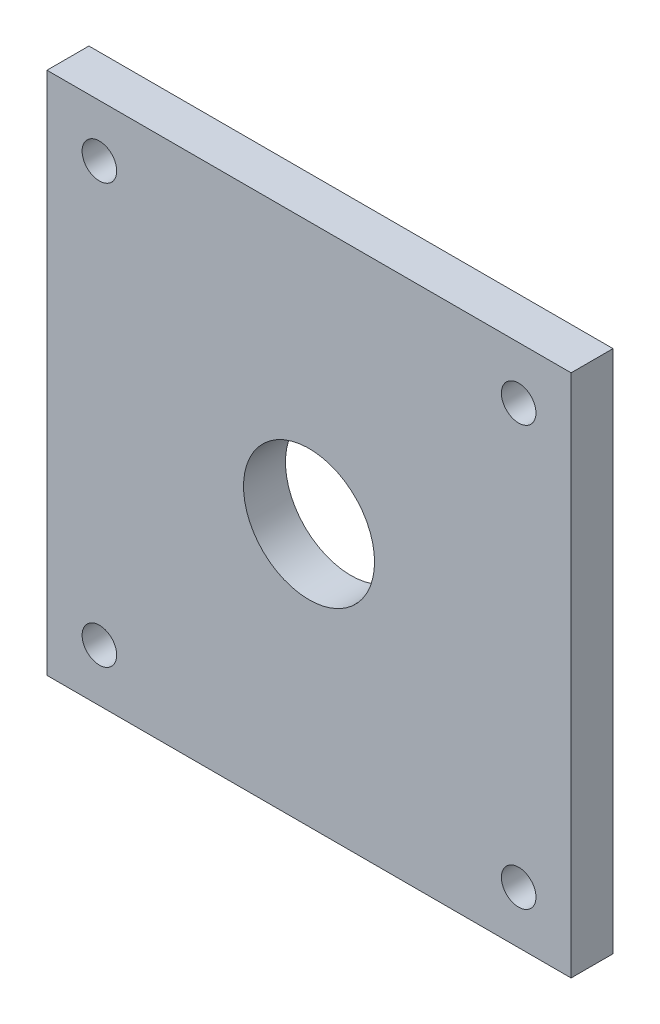
ISO-10303-21;
HEADER;
FILE_DESCRIPTION(('STEP AP214'),'2;1');
FILE_NAME('part.step','',(''),(''),'','','');
FILE_SCHEMA(('AUTOMOTIVE_DESIGN { 1 0 10303 214 1 1 1 1 }'));
ENDSEC;
DATA;
#1=APPLICATION_CONTEXT('core data for automotive mechanical design processes');
#2=APPLICATION_PROTOCOL_DEFINITION('international standard','automotive_design',2000,#1);
#3=PRODUCT_CONTEXT('',#1,'mechanical');
#4=PRODUCT('Part','Part','',(#3));
#5=PRODUCT_RELATED_PRODUCT_CATEGORY('part','',(#4));
#6=PRODUCT_DEFINITION_FORMATION('','',#4);
#7=PRODUCT_DEFINITION_CONTEXT('part definition',#1,'design');
#8=PRODUCT_DEFINITION('design','',#6,#7);
#9=PRODUCT_DEFINITION_SHAPE('','',#8);
#10=(LENGTH_UNIT() NAMED_UNIT(*) SI_UNIT(.MILLI.,.METRE.));
#11=(NAMED_UNIT(*) PLANE_ANGLE_UNIT() SI_UNIT($,.RADIAN.));
#12=(NAMED_UNIT(*) SI_UNIT($,.STERADIAN.) SOLID_ANGLE_UNIT());
#13=UNCERTAINTY_MEASURE_WITH_UNIT(LENGTH_MEASURE(1.E-05),#10,'distance_accuracy_value','');
#14=(GEOMETRIC_REPRESENTATION_CONTEXT(3) GLOBAL_UNCERTAINTY_ASSIGNED_CONTEXT((#13)) GLOBAL_UNIT_ASSIGNED_CONTEXT((#10,
#11,#12)) REPRESENTATION_CONTEXT('',''));
#15=CARTESIAN_POINT('',(0.,0.,0.));
#16=DIRECTION('',(0.,0.,1.));
#17=DIRECTION('',(1.,0.,0.));
#18=AXIS2_PLACEMENT_3D('',#15,#16,#17);
#19=CARTESIAN_POINT('',(0.,0.,4.));
#20=DIRECTION('',(0.,0.,-1.));
#21=DIRECTION('',(-1.,0.,0.));
#22=AXIS2_PLACEMENT_3D('',#19,#20,#21);
#23=PLANE('',#22);
#24=DIRECTION('',(0.,1.,0.));
#25=VECTOR('',#24,1.);
#26=CARTESIAN_POINT('',(25.,-25.,4.));
#27=LINE('',#26,#25);
#28=CARTESIAN_POINT('',(25.,-25.,4.));
#29=VERTEX_POINT('',#28);
#30=CARTESIAN_POINT('',(25.,25.,4.));
#31=VERTEX_POINT('',#30);
#32=EDGE_CURVE('E92',#29,#31,#27,.T.);
#33=ORIENTED_EDGE('',*,*,#32,.T.);
#34=DIRECTION('',(-1.,0.,0.));
#35=VECTOR('',#34,1.);
#36=CARTESIAN_POINT('',(-25.,25.,4.));
#37=LINE('',#36,#35);
#38=CARTESIAN_POINT('',(-25.,25.,4.));
#39=VERTEX_POINT('',#38);
#40=EDGE_CURVE('E87',#31,#39,#37,.T.);
#41=ORIENTED_EDGE('',*,*,#40,.T.);
#42=DIRECTION('',(0.,-1.,0.));
#43=VECTOR('',#42,1.);
#44=CARTESIAN_POINT('',(-25.,-25.,4.));
#45=LINE('',#44,#43);
#46=CARTESIAN_POINT('',(-25.,-25.,4.));
#47=VERTEX_POINT('',#46);
#48=EDGE_CURVE('E90',#39,#47,#45,.T.);
#49=ORIENTED_EDGE('',*,*,#48,.T.);
#50=DIRECTION('',(1.,0.,0.));
#51=VECTOR('',#50,1.);
#52=CARTESIAN_POINT('',(-25.,-25.,4.));
#53=LINE('',#52,#51);
#54=EDGE_CURVE('E57',#47,#29,#53,.T.);
#55=ORIENTED_EDGE('',*,*,#54,.T.);
#56=EDGE_LOOP('',(#33,#41,#49,#55));
#57=FACE_BOUND('',#56,.T.);
#58=CARTESIAN_POINT('',(-20.,-20.,4.));
#59=DIRECTION('',(0.,0.,1.));
#60=DIRECTION('',(1.,0.,0.));
#61=AXIS2_PLACEMENT_3D('',#58,#59,#60);
#62=CIRCLE('',#61,1.65);
#63=CARTESIAN_POINT('',(-18.35,-20.,4.));
#64=VERTEX_POINT('',#63);
#65=EDGE_CURVE('E112',#64,#64,#62,.T.);
#66=ORIENTED_EDGE('',*,*,#65,.F.);
#67=EDGE_LOOP('',(#66));
#68=FACE_BOUND('',#67,.T.);
#69=CARTESIAN_POINT('',(0.,0.,4.));
#70=DIRECTION('',(0.,0.,1.));
#71=DIRECTION('',(1.,0.,0.));
#72=AXIS2_PLACEMENT_3D('',#69,#70,#71);
#73=CIRCLE('',#72,6.25);
#74=CARTESIAN_POINT('',(6.25,0.,4.));
#75=VERTEX_POINT('',#74);
#76=EDGE_CURVE('E134',#75,#75,#73,.T.);
#77=ORIENTED_EDGE('',*,*,#76,.F.);
#78=EDGE_LOOP('',(#77));
#79=FACE_BOUND('',#78,.T.);
#80=CARTESIAN_POINT('',(-19.9999999999999,20.0000000000001,4.));
#81=DIRECTION('',(0.,0.,1.));
#82=DIRECTION('',(1.,0.,0.));
#83=AXIS2_PLACEMENT_3D('',#80,#81,#82);
#84=CIRCLE('',#83,1.65);
#85=CARTESIAN_POINT('',(-18.3499999999999,20.0000000000001,4.));
#86=VERTEX_POINT('',#85);
#87=EDGE_CURVE('E142',#86,#86,#84,.T.);
#88=ORIENTED_EDGE('',*,*,#87,.F.);
#89=EDGE_LOOP('',(#88));
#90=FACE_BOUND('',#89,.T.);
#91=CARTESIAN_POINT('',(20.0000000000001,19.9999999999999,4.));
#92=DIRECTION('',(0.,0.,1.));
#93=DIRECTION('',(1.,0.,0.));
#94=AXIS2_PLACEMENT_3D('',#91,#92,#93);
#95=CIRCLE('',#94,1.65);
#96=CARTESIAN_POINT('',(21.6500000000001,19.9999999999999,4.));
#97=VERTEX_POINT('',#96);
#98=EDGE_CURVE('E150',#97,#97,#95,.T.);
#99=ORIENTED_EDGE('',*,*,#98,.F.);
#100=EDGE_LOOP('',(#99));
#101=FACE_BOUND('',#100,.T.);
#102=CARTESIAN_POINT('',(19.9999999999998,-20.0000000000002,4.));
#103=DIRECTION('',(0.,0.,1.));
#104=DIRECTION('',(1.,0.,0.));
#105=AXIS2_PLACEMENT_3D('',#102,#103,#104);
#106=CIRCLE('',#105,1.65);
#107=CARTESIAN_POINT('',(21.6499999999998,-20.0000000000002,4.));
#108=VERTEX_POINT('',#107);
#109=EDGE_CURVE('E158',#108,#108,#106,.T.);
#110=ORIENTED_EDGE('',*,*,#109,.F.);
#111=EDGE_LOOP('',(#110));
#112=FACE_BOUND('',#111,.T.);
#113=ADVANCED_FACE('F39',(#57,#68,#79,#90,#101,#112),#23,.F.);
#114=CARTESIAN_POINT('',(0.,0.,0.));
#115=DIRECTION('',(0.,0.,-1.));
#116=DIRECTION('',(-1.,0.,0.));
#117=AXIS2_PLACEMENT_3D('',#114,#115,#116);
#118=PLANE('',#117);
#119=CARTESIAN_POINT('',(20.0000000000001,19.9999999999999,0.));
#120=DIRECTION('',(0.,0.,1.));
#121=DIRECTION('',(1.,0.,0.));
#122=AXIS2_PLACEMENT_3D('',#119,#120,#121);
#123=CIRCLE('',#122,1.65);
#124=CARTESIAN_POINT('',(21.6500000000001,19.9999999999999,0.));
#125=VERTEX_POINT('',#124);
#126=EDGE_CURVE('E154',#125,#125,#123,.T.);
#127=ORIENTED_EDGE('',*,*,#126,.T.);
#128=EDGE_LOOP('',(#127));
#129=FACE_BOUND('',#128,.T.);
#130=CARTESIAN_POINT('',(0.,0.,0.));
#131=DIRECTION('',(0.,0.,1.));
#132=DIRECTION('',(1.,0.,0.));
#133=AXIS2_PLACEMENT_3D('',#130,#131,#132);
#134=CIRCLE('',#133,6.25);
#135=CARTESIAN_POINT('',(6.25,0.,0.));
#136=VERTEX_POINT('',#135);
#137=EDGE_CURVE('E138',#136,#136,#134,.T.);
#138=ORIENTED_EDGE('',*,*,#137,.T.);
#139=EDGE_LOOP('',(#138));
#140=FACE_BOUND('',#139,.T.);
#141=DIRECTION('',(0.,1.,0.));
#142=VECTOR('',#141,1.);
#143=CARTESIAN_POINT('',(25.,-25.,0.));
#144=LINE('',#143,#142);
#145=CARTESIAN_POINT('',(25.,-25.,0.));
#146=VERTEX_POINT('',#145);
#147=CARTESIAN_POINT('',(25.,25.,0.));
#148=VERTEX_POINT('',#147);
#149=EDGE_CURVE('E108',#146,#148,#144,.T.);
#150=ORIENTED_EDGE('',*,*,#149,.F.);
#151=DIRECTION('',(1.,0.,0.));
#152=VECTOR('',#151,1.);
#153=CARTESIAN_POINT('',(-25.,-25.,0.));
#154=LINE('',#153,#152);
#155=CARTESIAN_POINT('',(-25.,-25.,0.));
#156=VERTEX_POINT('',#155);
#157=EDGE_CURVE('E80',#156,#146,#154,.T.);
#158=ORIENTED_EDGE('',*,*,#157,.F.);
#159=DIRECTION('',(0.,-1.,0.));
#160=VECTOR('',#159,1.);
#161=CARTESIAN_POINT('',(-25.,-25.,0.));
#162=LINE('',#161,#160);
#163=CARTESIAN_POINT('',(-25.,25.,0.));
#164=VERTEX_POINT('',#163);
#165=EDGE_CURVE('E74',#164,#156,#162,.T.);
#166=ORIENTED_EDGE('',*,*,#165,.F.);
#167=DIRECTION('',(-1.,0.,0.));
#168=VECTOR('',#167,1.);
#169=CARTESIAN_POINT('',(-25.,25.,0.));
#170=LINE('',#169,#168);
#171=EDGE_CURVE('E97',#148,#164,#170,.T.);
#172=ORIENTED_EDGE('',*,*,#171,.F.);
#173=EDGE_LOOP('',(#150,#158,#166,#172));
#174=FACE_BOUND('',#173,.T.);
#175=CARTESIAN_POINT('',(-20.,-20.,0.));
#176=DIRECTION('',(0.,0.,1.));
#177=DIRECTION('',(1.,0.,0.));
#178=AXIS2_PLACEMENT_3D('',#175,#176,#177);
#179=CIRCLE('',#178,1.65);
#180=CARTESIAN_POINT('',(-18.35,-20.,0.));
#181=VERTEX_POINT('',#180);
#182=EDGE_CURVE('E130',#181,#181,#179,.T.);
#183=ORIENTED_EDGE('',*,*,#182,.T.);
#184=EDGE_LOOP('',(#183));
#185=FACE_BOUND('',#184,.T.);
#186=CARTESIAN_POINT('',(-19.9999999999999,20.0000000000001,0.));
#187=DIRECTION('',(0.,0.,1.));
#188=DIRECTION('',(1.,0.,0.));
#189=AXIS2_PLACEMENT_3D('',#186,#187,#188);
#190=CIRCLE('',#189,1.65);
#191=CARTESIAN_POINT('',(-18.3499999999999,20.0000000000001,0.));
#192=VERTEX_POINT('',#191);
#193=EDGE_CURVE('E146',#192,#192,#190,.T.);
#194=ORIENTED_EDGE('',*,*,#193,.T.);
#195=EDGE_LOOP('',(#194));
#196=FACE_BOUND('',#195,.T.);
#197=CARTESIAN_POINT('',(19.9999999999998,-20.0000000000002,0.));
#198=DIRECTION('',(0.,0.,1.));
#199=DIRECTION('',(1.,0.,0.));
#200=AXIS2_PLACEMENT_3D('',#197,#198,#199);
#201=CIRCLE('',#200,1.65);
#202=CARTESIAN_POINT('',(21.6499999999998,-20.0000000000002,0.));
#203=VERTEX_POINT('',#202);
#204=EDGE_CURVE('E162',#203,#203,#201,.T.);
#205=ORIENTED_EDGE('',*,*,#204,.T.);
#206=EDGE_LOOP('',(#205));
#207=FACE_BOUND('',#206,.T.);
#208=ADVANCED_FACE('F125',(#129,#140,#174,#185,#196,#207),#118,.T.);
#209=CARTESIAN_POINT('',(25.,-25.,4.));
#210=DIRECTION('',(-1.,0.,0.));
#211=DIRECTION('',(0.,0.,1.));
#212=AXIS2_PLACEMENT_3D('',#209,#210,#211);
#213=PLANE('',#212);
#214=ORIENTED_EDGE('',*,*,#149,.T.);
#215=DIRECTION('',(0.,0.,-1.));
#216=VECTOR('',#215,1.);
#217=CARTESIAN_POINT('',(25.,25.,4.));
#218=LINE('',#217,#216);
#219=EDGE_CURVE('E11',#31,#148,#218,.T.);
#220=ORIENTED_EDGE('',*,*,#219,.F.);
#221=ORIENTED_EDGE('',*,*,#32,.F.);
#222=DIRECTION('',(0.,0.,-1.));
#223=VECTOR('',#222,1.);
#224=CARTESIAN_POINT('',(25.,-25.,4.));
#225=LINE('',#224,#223);
#226=EDGE_CURVE('E104',#29,#146,#225,.T.);
#227=ORIENTED_EDGE('',*,*,#226,.T.);
#228=EDGE_LOOP('',(#214,#220,#221,#227));
#229=FACE_BOUND('',#228,.T.);
#230=ADVANCED_FACE('F41',(#229),#213,.F.);
#231=CARTESIAN_POINT('',(-25.,25.,4.));
#232=DIRECTION('',(0.,-1.,0.));
#233=DIRECTION('',(0.,0.,-1.));
#234=AXIS2_PLACEMENT_3D('',#231,#232,#233);
#235=PLANE('',#234);
#236=ORIENTED_EDGE('',*,*,#171,.T.);
#237=DIRECTION('',(0.,0.,-1.));
#238=VECTOR('',#237,1.);
#239=CARTESIAN_POINT('',(-25.,25.,4.));
#240=LINE('',#239,#238);
#241=EDGE_CURVE('E49',#39,#164,#240,.T.);
#242=ORIENTED_EDGE('',*,*,#241,.F.);
#243=ORIENTED_EDGE('',*,*,#40,.F.);
#244=ORIENTED_EDGE('',*,*,#219,.T.);
#245=EDGE_LOOP('',(#236,#242,#243,#244));
#246=FACE_BOUND('',#245,.T.);
#247=ADVANCED_FACE('F96',(#246),#235,.F.);
#248=CARTESIAN_POINT('',(-25.,-25.,4.));
#249=DIRECTION('',(1.,0.,0.));
#250=DIRECTION('',(0.,0.,-1.));
#251=AXIS2_PLACEMENT_3D('',#248,#249,#250);
#252=PLANE('',#251);
#253=ORIENTED_EDGE('',*,*,#165,.T.);
#254=DIRECTION('',(0.,0.,-1.));
#255=VECTOR('',#254,1.);
#256=CARTESIAN_POINT('',(-25.,-25.,4.));
#257=LINE('',#256,#255);
#258=EDGE_CURVE('E99',#47,#156,#257,.T.);
#259=ORIENTED_EDGE('',*,*,#258,.F.);
#260=ORIENTED_EDGE('',*,*,#48,.F.);
#261=ORIENTED_EDGE('',*,*,#241,.T.);
#262=EDGE_LOOP('',(#253,#259,#260,#261));
#263=FACE_BOUND('',#262,.T.);
#264=ADVANCED_FACE('F100',(#263),#252,.F.);
#265=CARTESIAN_POINT('',(-25.,-25.,4.));
#266=DIRECTION('',(0.,1.,0.));
#267=DIRECTION('',(0.,0.,1.));
#268=AXIS2_PLACEMENT_3D('',#265,#266,#267);
#269=PLANE('',#268);
#270=ORIENTED_EDGE('',*,*,#157,.T.);
#271=ORIENTED_EDGE('',*,*,#226,.F.);
#272=ORIENTED_EDGE('',*,*,#54,.F.);
#273=ORIENTED_EDGE('',*,*,#258,.T.);
#274=EDGE_LOOP('',(#270,#271,#272,#273));
#275=FACE_BOUND('',#274,.T.);
#276=ADVANCED_FACE('F122',(#275),#269,.F.);
#277=CARTESIAN_POINT('',(-20.,-20.,4.));
#278=DIRECTION('',(0.,0.,-1.));
#279=DIRECTION('',(-1.,0.,0.));
#280=AXIS2_PLACEMENT_3D('',#277,#278,#279);
#281=CYLINDRICAL_SURFACE('',#280,1.65);
#282=ORIENTED_EDGE('',*,*,#65,.T.);
#283=EDGE_LOOP('',(#282));
#284=FACE_BOUND('',#283,.T.);
#285=ORIENTED_EDGE('',*,*,#182,.F.);
#286=EDGE_LOOP('',(#285));
#287=FACE_BOUND('',#286,.T.);
#288=ADVANCED_FACE('F181',(#284,#287),#281,.F.);
#289=CARTESIAN_POINT('',(0.,0.,4.));
#290=DIRECTION('',(0.,0.,-1.));
#291=DIRECTION('',(-1.,0.,0.));
#292=AXIS2_PLACEMENT_3D('',#289,#290,#291);
#293=CYLINDRICAL_SURFACE('',#292,6.25);
#294=ORIENTED_EDGE('',*,*,#76,.T.);
#295=EDGE_LOOP('',(#294));
#296=FACE_BOUND('',#295,.T.);
#297=ORIENTED_EDGE('',*,*,#137,.F.);
#298=EDGE_LOOP('',(#297));
#299=FACE_BOUND('',#298,.T.);
#300=ADVANCED_FACE('F227',(#296,#299),#293,.F.);
#301=CARTESIAN_POINT('',(-19.9999999999999,20.0000000000001,4.));
#302=DIRECTION('',(0.,0.,-1.));
#303=DIRECTION('',(-1.,0.,0.));
#304=AXIS2_PLACEMENT_3D('',#301,#302,#303);
#305=CYLINDRICAL_SURFACE('',#304,1.65);
#306=ORIENTED_EDGE('',*,*,#87,.T.);
#307=EDGE_LOOP('',(#306));
#308=FACE_BOUND('',#307,.T.);
#309=ORIENTED_EDGE('',*,*,#193,.F.);
#310=EDGE_LOOP('',(#309));
#311=FACE_BOUND('',#310,.T.);
#312=ADVANCED_FACE('F235',(#308,#311),#305,.F.);
#313=CARTESIAN_POINT('',(20.0000000000001,19.9999999999999,4.));
#314=DIRECTION('',(0.,0.,-1.));
#315=DIRECTION('',(-1.,0.,0.));
#316=AXIS2_PLACEMENT_3D('',#313,#314,#315);
#317=CYLINDRICAL_SURFACE('',#316,1.65);
#318=ORIENTED_EDGE('',*,*,#98,.T.);
#319=EDGE_LOOP('',(#318));
#320=FACE_BOUND('',#319,.T.);
#321=ORIENTED_EDGE('',*,*,#126,.F.);
#322=EDGE_LOOP('',(#321));
#323=FACE_BOUND('',#322,.T.);
#324=ADVANCED_FACE('F243',(#320,#323),#317,.F.);
#325=CARTESIAN_POINT('',(19.9999999999998,-20.0000000000002,4.));
#326=DIRECTION('',(0.,0.,-1.));
#327=DIRECTION('',(-1.,0.,0.));
#328=AXIS2_PLACEMENT_3D('',#325,#326,#327);
#329=CYLINDRICAL_SURFACE('',#328,1.65);
#330=ORIENTED_EDGE('',*,*,#109,.T.);
#331=EDGE_LOOP('',(#330));
#332=FACE_BOUND('',#331,.T.);
#333=ORIENTED_EDGE('',*,*,#204,.F.);
#334=EDGE_LOOP('',(#333));
#335=FACE_BOUND('',#334,.T.);
#336=ADVANCED_FACE('F170',(#332,#335),#329,.F.);
#337=CLOSED_SHELL('',(#113,#208,#230,#247,#264,#276,#288,#300,#312,#324,#336));
#338=MANIFOLD_SOLID_BREP('B2',#337);
#339=ADVANCED_BREP_SHAPE_REPRESENTATION('',(#18,#338),#14);
#340=SHAPE_DEFINITION_REPRESENTATION(#9,#339);
ENDSEC;
END-ISO-10303-21;
